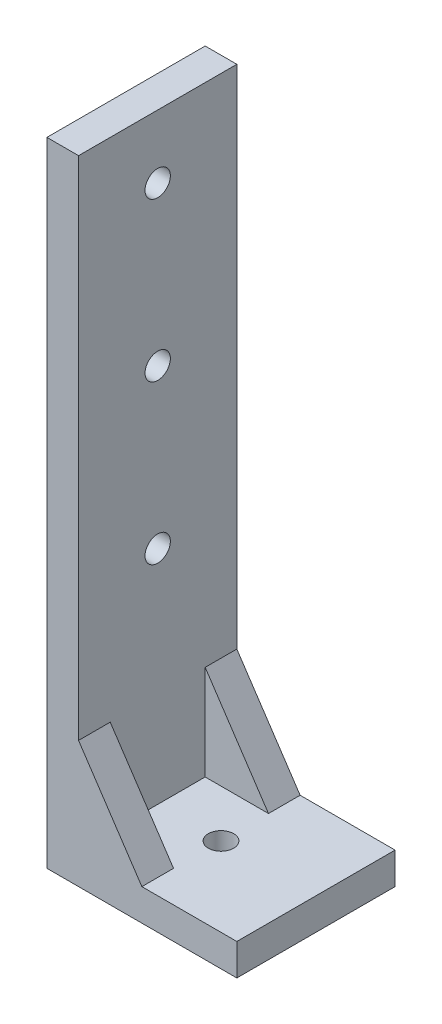
ISO-10303-21;
HEADER;
FILE_DESCRIPTION(('STEP AP214'),'2;1');
FILE_NAME('part.step','',(''),(''),'','','');
FILE_SCHEMA(('AUTOMOTIVE_DESIGN { 1 0 10303 214 1 1 1 1 }'));
ENDSEC;
DATA;
#1=APPLICATION_CONTEXT('core data for automotive mechanical design processes');
#2=APPLICATION_PROTOCOL_DEFINITION('international standard','automotive_design',2000,#1);
#3=PRODUCT_CONTEXT('',#1,'mechanical');
#4=PRODUCT('Part','Part','',(#3));
#5=PRODUCT_RELATED_PRODUCT_CATEGORY('part','',(#4));
#6=PRODUCT_DEFINITION_FORMATION('','',#4);
#7=PRODUCT_DEFINITION_CONTEXT('part definition',#1,'design');
#8=PRODUCT_DEFINITION('design','',#6,#7);
#9=PRODUCT_DEFINITION_SHAPE('','',#8);
#10=(LENGTH_UNIT() NAMED_UNIT(*) SI_UNIT(.MILLI.,.METRE.));
#11=(NAMED_UNIT(*) PLANE_ANGLE_UNIT() SI_UNIT($,.RADIAN.));
#12=(NAMED_UNIT(*) SI_UNIT($,.STERADIAN.) SOLID_ANGLE_UNIT());
#13=UNCERTAINTY_MEASURE_WITH_UNIT(LENGTH_MEASURE(1.E-05),#10,'distance_accuracy_value','');
#14=(GEOMETRIC_REPRESENTATION_CONTEXT(3) GLOBAL_UNCERTAINTY_ASSIGNED_CONTEXT((#13)) GLOBAL_UNIT_ASSIGNED_CONTEXT((#10,
#11,#12)) REPRESENTATION_CONTEXT('',''));
#15=CARTESIAN_POINT('',(0.,0.,0.));
#16=DIRECTION('',(0.,0.,1.));
#17=DIRECTION('',(1.,0.,0.));
#18=AXIS2_PLACEMENT_3D('',#15,#16,#17);
#19=CARTESIAN_POINT('',(60.,10.,25.));
#20=DIRECTION('',(0.,-1.,0.));
#21=DIRECTION('',(1.,0.,0.));
#22=AXIS2_PLACEMENT_3D('',#19,#20,#21);
#23=PLANE('',#22);
#24=CARTESIAN_POINT('',(30.,9.99999999999999,0.));
#25=DIRECTION('',(0.,1.,0.));
#26=DIRECTION('',(-1.,0.,0.));
#27=AXIS2_PLACEMENT_3D('',#24,#25,#26);
#28=CIRCLE('',#27,4.);
#29=CARTESIAN_POINT('',(26.,9.99999999999999,0.));
#30=VERTEX_POINT('',#29);
#31=EDGE_CURVE('E168',#30,#30,#28,.T.);
#32=ORIENTED_EDGE('',*,*,#31,.F.);
#33=EDGE_LOOP('',(#32));
#34=FACE_BOUND('',#33,.T.);
#35=DIRECTION('',(0.,0.,-1.));
#36=VECTOR('',#35,1.);
#37=CARTESIAN_POINT('',(30.,10.,-15.));
#38=LINE('',#37,#36);
#39=CARTESIAN_POINT('',(30.,10.,-15.));
#40=VERTEX_POINT('',#39);
#41=CARTESIAN_POINT('',(30.,9.99999999999999,-25.));
#42=VERTEX_POINT('',#41);
#43=EDGE_CURVE('E48',#40,#42,#38,.T.);
#44=ORIENTED_EDGE('',*,*,#43,.F.);
#45=DIRECTION('',(1.,0.,0.));
#46=VECTOR('',#45,1.);
#47=CARTESIAN_POINT('',(10.,9.99999999999999,-15.));
#48=LINE('',#47,#46);
#49=CARTESIAN_POINT('',(10.,9.99999999999999,-15.));
#50=VERTEX_POINT('',#49);
#51=EDGE_CURVE('E127',#50,#40,#48,.T.);
#52=ORIENTED_EDGE('',*,*,#51,.F.);
#53=DIRECTION('',(0.,0.,-1.));
#54=VECTOR('',#53,1.);
#55=CARTESIAN_POINT('',(10.,9.99999999999999,25.));
#56=LINE('',#55,#54);
#57=CARTESIAN_POINT('',(10.,9.99999999999999,15.));
#58=VERTEX_POINT('',#57);
#59=EDGE_CURVE('E122',#58,#50,#56,.T.);
#60=ORIENTED_EDGE('',*,*,#59,.F.);
#61=DIRECTION('',(1.,0.,0.));
#62=VECTOR('',#61,1.);
#63=CARTESIAN_POINT('',(10.,9.99999999999999,15.));
#64=LINE('',#63,#62);
#65=CARTESIAN_POINT('',(30.,10.,15.));
#66=VERTEX_POINT('',#65);
#67=EDGE_CURVE('E111',#58,#66,#64,.T.);
#68=ORIENTED_EDGE('',*,*,#67,.T.);
#69=DIRECTION('',(0.,0.,1.));
#70=VECTOR('',#69,1.);
#71=CARTESIAN_POINT('',(30.,10.,15.));
#72=LINE('',#71,#70);
#73=CARTESIAN_POINT('',(30.,10.,25.));
#74=VERTEX_POINT('',#73);
#75=EDGE_CURVE('E191',#66,#74,#72,.T.);
#76=ORIENTED_EDGE('',*,*,#75,.T.);
#77=DIRECTION('',(-1.,0.,0.));
#78=VECTOR('',#77,1.);
#79=CARTESIAN_POINT('',(60.,10.,25.));
#80=LINE('',#79,#78);
#81=CARTESIAN_POINT('',(60.,10.,25.));
#82=VERTEX_POINT('',#81);
#83=EDGE_CURVE('E161',#82,#74,#80,.T.);
#84=ORIENTED_EDGE('',*,*,#83,.F.);
#85=DIRECTION('',(0.,0.,-1.));
#86=VECTOR('',#85,1.);
#87=CARTESIAN_POINT('',(60.,10.,25.));
#88=LINE('',#87,#86);
#89=CARTESIAN_POINT('',(60.,10.,-25.));
#90=VERTEX_POINT('',#89);
#91=EDGE_CURVE('E41',#82,#90,#88,.T.);
#92=ORIENTED_EDGE('',*,*,#91,.T.);
#93=DIRECTION('',(-1.,0.,0.));
#94=VECTOR('',#93,1.);
#95=CARTESIAN_POINT('',(60.,10.,-25.));
#96=LINE('',#95,#94);
#97=EDGE_CURVE('E148',#90,#42,#96,.T.);
#98=ORIENTED_EDGE('',*,*,#97,.T.);
#99=EDGE_LOOP('',(#44,#52,#60,#68,#76,#84,#92,#98));
#100=FACE_BOUND('',#99,.T.);
#101=ADVANCED_FACE('F33',(#34,#100),#23,.F.);
#102=CARTESIAN_POINT('',(10.,9.99999999999999,25.));
#103=DIRECTION('',(-1.,0.,0.));
#104=DIRECTION('',(0.,0.,1.));
#105=AXIS2_PLACEMENT_3D('',#102,#103,#104);
#106=PLANE('',#105);
#107=CARTESIAN_POINT('',(10.,80.,0.));
#108=DIRECTION('',(1.,0.,0.));
#109=DIRECTION('',(0.,0.,-1.));
#110=AXIS2_PLACEMENT_3D('',#107,#108,#109);
#111=CIRCLE('',#110,4.);
#112=CARTESIAN_POINT('',(10.,80.,-4.));
#113=VERTEX_POINT('',#112);
#114=EDGE_CURVE('E174',#113,#113,#111,.T.);
#115=ORIENTED_EDGE('',*,*,#114,.F.);
#116=EDGE_LOOP('',(#115));
#117=FACE_BOUND('',#116,.T.);
#118=CARTESIAN_POINT('',(10.,130.,0.));
#119=DIRECTION('',(1.,0.,0.));
#120=DIRECTION('',(0.,0.,-1.));
#121=AXIS2_PLACEMENT_3D('',#118,#119,#120);
#122=CIRCLE('',#121,4.);
#123=CARTESIAN_POINT('',(10.,130.,-4.));
#124=VERTEX_POINT('',#123);
#125=EDGE_CURVE('E180',#124,#124,#122,.T.);
#126=ORIENTED_EDGE('',*,*,#125,.F.);
#127=EDGE_LOOP('',(#126));
#128=FACE_BOUND('',#127,.T.);
#129=CARTESIAN_POINT('',(10.,180.,0.));
#130=DIRECTION('',(1.,0.,0.));
#131=DIRECTION('',(0.,0.,-1.));
#132=AXIS2_PLACEMENT_3D('',#129,#130,#131);
#133=CIRCLE('',#132,4.);
#134=CARTESIAN_POINT('',(10.,180.,-4.));
#135=VERTEX_POINT('',#134);
#136=EDGE_CURVE('E186',#135,#135,#133,.T.);
#137=ORIENTED_EDGE('',*,*,#136,.F.);
#138=EDGE_LOOP('',(#137));
#139=FACE_BOUND('',#138,.T.);
#140=DIRECTION('',(0.,0.,-1.));
#141=VECTOR('',#140,1.);
#142=CARTESIAN_POINT('',(10.,40.,-15.));
#143=LINE('',#142,#141);
#144=CARTESIAN_POINT('',(10.,40.,-15.));
#145=VERTEX_POINT('',#144);
#146=CARTESIAN_POINT('',(10.,40.,-25.));
#147=VERTEX_POINT('',#146);
#148=EDGE_CURVE('E197',#145,#147,#143,.T.);
#149=ORIENTED_EDGE('',*,*,#148,.T.);
#150=DIRECTION('',(0.,1.,0.));
#151=VECTOR('',#150,1.);
#152=CARTESIAN_POINT('',(10.,9.99999999999999,-25.));
#153=LINE('',#152,#151);
#154=CARTESIAN_POINT('',(10.,200.,-25.));
#155=VERTEX_POINT('',#154);
#156=EDGE_CURVE('E146',#147,#155,#153,.T.);
#157=ORIENTED_EDGE('',*,*,#156,.T.);
#158=DIRECTION('',(0.,0.,-1.));
#159=VECTOR('',#158,1.);
#160=CARTESIAN_POINT('',(10.,200.,25.));
#161=LINE('',#160,#159);
#162=CARTESIAN_POINT('',(10.,200.,25.));
#163=VERTEX_POINT('',#162);
#164=EDGE_CURVE('E128',#163,#155,#161,.T.);
#165=ORIENTED_EDGE('',*,*,#164,.F.);
#166=DIRECTION('',(0.,1.,0.));
#167=VECTOR('',#166,1.);
#168=CARTESIAN_POINT('',(10.,9.99999999999999,25.));
#169=LINE('',#168,#167);
#170=CARTESIAN_POINT('',(10.,40.,25.));
#171=VERTEX_POINT('',#170);
#172=EDGE_CURVE('E159',#171,#163,#169,.T.);
#173=ORIENTED_EDGE('',*,*,#172,.F.);
#174=DIRECTION('',(0.,0.,1.));
#175=VECTOR('',#174,1.);
#176=CARTESIAN_POINT('',(10.,40.,15.));
#177=LINE('',#176,#175);
#178=CARTESIAN_POINT('',(10.,40.,15.));
#179=VERTEX_POINT('',#178);
#180=EDGE_CURVE('E124',#179,#171,#177,.T.);
#181=ORIENTED_EDGE('',*,*,#180,.F.);
#182=DIRECTION('',(0.,-1.,0.));
#183=VECTOR('',#182,1.);
#184=CARTESIAN_POINT('',(10.,40.,15.));
#185=LINE('',#184,#183);
#186=EDGE_CURVE('E114',#179,#58,#185,.T.);
#187=ORIENTED_EDGE('',*,*,#186,.T.);
#188=ORIENTED_EDGE('',*,*,#59,.T.);
#189=DIRECTION('',(0.,-1.,0.));
#190=VECTOR('',#189,1.);
#191=CARTESIAN_POINT('',(10.,40.,-15.));
#192=LINE('',#191,#190);
#193=EDGE_CURVE('E56',#145,#50,#192,.T.);
#194=ORIENTED_EDGE('',*,*,#193,.F.);
#195=EDGE_LOOP('',(#149,#157,#165,#173,#181,#187,#188,#194));
#196=FACE_BOUND('',#195,.T.);
#197=ADVANCED_FACE('F121',(#117,#128,#139,#196),#106,.F.);
#198=CARTESIAN_POINT('',(0.,0.,25.));
#199=DIRECTION('',(0.,1.,0.));
#200=DIRECTION('',(0.,0.,1.));
#201=AXIS2_PLACEMENT_3D('',#198,#199,#200);
#202=PLANE('',#201);
#203=CARTESIAN_POINT('',(30.,0.,0.));
#204=DIRECTION('',(0.,1.,0.));
#205=DIRECTION('',(-1.,0.,0.));
#206=AXIS2_PLACEMENT_3D('',#203,#204,#205);
#207=CIRCLE('',#206,4.);
#208=CARTESIAN_POINT('',(26.,0.,0.));
#209=VERTEX_POINT('',#208);
#210=EDGE_CURVE('E155',#209,#209,#207,.T.);
#211=ORIENTED_EDGE('',*,*,#210,.T.);
#212=EDGE_LOOP('',(#211));
#213=FACE_BOUND('',#212,.T.);
#214=DIRECTION('',(1.,0.,0.));
#215=VECTOR('',#214,1.);
#216=CARTESIAN_POINT('',(0.,0.,-25.));
#217=LINE('',#216,#215);
#218=CARTESIAN_POINT('',(0.,0.,-25.));
#219=VERTEX_POINT('',#218);
#220=CARTESIAN_POINT('',(60.,0.,-25.));
#221=VERTEX_POINT('',#220);
#222=EDGE_CURVE('E152',#219,#221,#217,.T.);
#223=ORIENTED_EDGE('',*,*,#222,.T.);
#224=DIRECTION('',(0.,0.,-1.));
#225=VECTOR('',#224,1.);
#226=CARTESIAN_POINT('',(60.,0.,25.));
#227=LINE('',#226,#225);
#228=CARTESIAN_POINT('',(60.,0.,25.));
#229=VERTEX_POINT('',#228);
#230=EDGE_CURVE('E11',#229,#221,#227,.T.);
#231=ORIENTED_EDGE('',*,*,#230,.F.);
#232=DIRECTION('',(1.,0.,0.));
#233=VECTOR('',#232,1.);
#234=CARTESIAN_POINT('',(0.,0.,25.));
#235=LINE('',#234,#233);
#236=CARTESIAN_POINT('',(0.,0.,25.));
#237=VERTEX_POINT('',#236);
#238=EDGE_CURVE('E143',#237,#229,#235,.T.);
#239=ORIENTED_EDGE('',*,*,#238,.F.);
#240=DIRECTION('',(0.,0.,-1.));
#241=VECTOR('',#240,1.);
#242=CARTESIAN_POINT('',(0.,0.,25.));
#243=LINE('',#242,#241);
#244=EDGE_CURVE('E137',#237,#219,#243,.T.);
#245=ORIENTED_EDGE('',*,*,#244,.T.);
#246=EDGE_LOOP('',(#223,#231,#239,#245));
#247=FACE_BOUND('',#246,.T.);
#248=ADVANCED_FACE('F35',(#213,#247),#202,.F.);
#249=CARTESIAN_POINT('',(60.,0.,25.));
#250=DIRECTION('',(-1.,0.,0.));
#251=DIRECTION('',(0.,0.,1.));
#252=AXIS2_PLACEMENT_3D('',#249,#250,#251);
#253=PLANE('',#252);
#254=DIRECTION('',(0.,1.,0.));
#255=VECTOR('',#254,1.);
#256=CARTESIAN_POINT('',(60.,0.,-25.));
#257=LINE('',#256,#255);
#258=EDGE_CURVE('E150',#221,#90,#257,.T.);
#259=ORIENTED_EDGE('',*,*,#258,.T.);
#260=ORIENTED_EDGE('',*,*,#91,.F.);
#261=DIRECTION('',(0.,1.,0.));
#262=VECTOR('',#261,1.);
#263=CARTESIAN_POINT('',(60.,0.,25.));
#264=LINE('',#263,#262);
#265=EDGE_CURVE('E164',#229,#82,#264,.T.);
#266=ORIENTED_EDGE('',*,*,#265,.F.);
#267=ORIENTED_EDGE('',*,*,#230,.T.);
#268=EDGE_LOOP('',(#259,#260,#266,#267));
#269=FACE_BOUND('',#268,.T.);
#270=ADVANCED_FACE('F238',(#269),#253,.F.);
#271=CARTESIAN_POINT('',(10.,200.,25.));
#272=DIRECTION('',(0.,-1.,0.));
#273=DIRECTION('',(0.,0.,-1.));
#274=AXIS2_PLACEMENT_3D('',#271,#272,#273);
#275=PLANE('',#274);
#276=DIRECTION('',(-1.,0.,0.));
#277=VECTOR('',#276,1.);
#278=CARTESIAN_POINT('',(10.,200.,-25.));
#279=LINE('',#278,#277);
#280=CARTESIAN_POINT('',(0.,200.,-25.));
#281=VERTEX_POINT('',#280);
#282=EDGE_CURVE('E144',#155,#281,#279,.T.);
#283=ORIENTED_EDGE('',*,*,#282,.T.);
#284=DIRECTION('',(0.,0.,-1.));
#285=VECTOR('',#284,1.);
#286=CARTESIAN_POINT('',(0.,200.,25.));
#287=LINE('',#286,#285);
#288=CARTESIAN_POINT('',(0.,200.,25.));
#289=VERTEX_POINT('',#288);
#290=EDGE_CURVE('E132',#289,#281,#287,.T.);
#291=ORIENTED_EDGE('',*,*,#290,.F.);
#292=DIRECTION('',(-1.,0.,0.));
#293=VECTOR('',#292,1.);
#294=CARTESIAN_POINT('',(10.,200.,25.));
#295=LINE('',#294,#293);
#296=EDGE_CURVE('E157',#163,#289,#295,.T.);
#297=ORIENTED_EDGE('',*,*,#296,.F.);
#298=ORIENTED_EDGE('',*,*,#164,.T.);
#299=EDGE_LOOP('',(#283,#291,#297,#298));
#300=FACE_BOUND('',#299,.T.);
#301=ADVANCED_FACE('F223',(#300),#275,.F.);
#302=CARTESIAN_POINT('',(0.,0.,25.));
#303=DIRECTION('',(1.,0.,0.));
#304=DIRECTION('',(0.,0.,-1.));
#305=AXIS2_PLACEMENT_3D('',#302,#303,#304);
#306=PLANE('',#305);
#307=CARTESIAN_POINT('',(0.,180.,0.));
#308=DIRECTION('',(1.,0.,0.));
#309=DIRECTION('',(0.,0.,-1.));
#310=AXIS2_PLACEMENT_3D('',#307,#308,#309);
#311=CIRCLE('',#310,4.);
#312=CARTESIAN_POINT('',(0.,180.,-4.));
#313=VERTEX_POINT('',#312);
#314=EDGE_CURVE('E171',#313,#313,#311,.T.);
#315=ORIENTED_EDGE('',*,*,#314,.T.);
#316=EDGE_LOOP('',(#315));
#317=FACE_BOUND('',#316,.T.);
#318=CARTESIAN_POINT('',(0.,130.,0.));
#319=DIRECTION('',(1.,0.,0.));
#320=DIRECTION('',(0.,0.,-1.));
#321=AXIS2_PLACEMENT_3D('',#318,#319,#320);
#322=CIRCLE('',#321,4.);
#323=CARTESIAN_POINT('',(0.,130.,-4.));
#324=VERTEX_POINT('',#323);
#325=EDGE_CURVE('E183',#324,#324,#322,.T.);
#326=ORIENTED_EDGE('',*,*,#325,.T.);
#327=EDGE_LOOP('',(#326));
#328=FACE_BOUND('',#327,.T.);
#329=CARTESIAN_POINT('',(0.,80.,0.));
#330=DIRECTION('',(1.,0.,0.));
#331=DIRECTION('',(0.,0.,-1.));
#332=AXIS2_PLACEMENT_3D('',#329,#330,#331);
#333=CIRCLE('',#332,4.);
#334=CARTESIAN_POINT('',(0.,80.,-4.));
#335=VERTEX_POINT('',#334);
#336=EDGE_CURVE('E177',#335,#335,#333,.T.);
#337=ORIENTED_EDGE('',*,*,#336,.T.);
#338=EDGE_LOOP('',(#337));
#339=FACE_BOUND('',#338,.T.);
#340=DIRECTION('',(0.,-1.,0.));
#341=VECTOR('',#340,1.);
#342=CARTESIAN_POINT('',(0.,0.,-25.));
#343=LINE('',#342,#341);
#344=EDGE_CURVE('E141',#281,#219,#343,.T.);
#345=ORIENTED_EDGE('',*,*,#344,.T.);
#346=ORIENTED_EDGE('',*,*,#244,.F.);
#347=DIRECTION('',(0.,-1.,0.));
#348=VECTOR('',#347,1.);
#349=CARTESIAN_POINT('',(0.,0.,25.));
#350=LINE('',#349,#348);
#351=EDGE_CURVE('E140',#289,#237,#350,.T.);
#352=ORIENTED_EDGE('',*,*,#351,.F.);
#353=ORIENTED_EDGE('',*,*,#290,.T.);
#354=EDGE_LOOP('',(#345,#346,#352,#353));
#355=FACE_BOUND('',#354,.T.);
#356=ADVANCED_FACE('F227',(#317,#328,#339,#355),#306,.F.);
#357=CARTESIAN_POINT('',(0.,0.,25.));
#358=DIRECTION('',(0.,0.,1.));
#359=DIRECTION('',(1.,0.,0.));
#360=AXIS2_PLACEMENT_3D('',#357,#358,#359);
#361=PLANE('',#360);
#362=DIRECTION('',(-0.554700196225229,0.832050294337844,0.));
#363=VECTOR('',#362,1.);
#364=CARTESIAN_POINT('',(30.,10.,25.));
#365=LINE('',#364,#363);
#366=EDGE_CURVE('E125',#74,#171,#365,.T.);
#367=ORIENTED_EDGE('',*,*,#366,.T.);
#368=ORIENTED_EDGE('',*,*,#172,.T.);
#369=ORIENTED_EDGE('',*,*,#296,.T.);
#370=ORIENTED_EDGE('',*,*,#351,.T.);
#371=ORIENTED_EDGE('',*,*,#238,.T.);
#372=ORIENTED_EDGE('',*,*,#265,.T.);
#373=ORIENTED_EDGE('',*,*,#83,.T.);
#374=EDGE_LOOP('',(#367,#368,#369,#370,#371,#372,#373));
#375=FACE_BOUND('',#374,.T.);
#376=ADVANCED_FACE('F231',(#375),#361,.T.);
#377=CARTESIAN_POINT('',(0.,0.,-25.));
#378=DIRECTION('',(0.,0.,1.));
#379=DIRECTION('',(1.,0.,0.));
#380=AXIS2_PLACEMENT_3D('',#377,#378,#379);
#381=PLANE('',#380);
#382=ORIENTED_EDGE('',*,*,#156,.F.);
#383=DIRECTION('',(-0.554700196225229,0.832050294337844,0.));
#384=VECTOR('',#383,1.);
#385=CARTESIAN_POINT('',(30.,10.,-25.));
#386=LINE('',#385,#384);
#387=EDGE_CURVE('E200',#42,#147,#386,.T.);
#388=ORIENTED_EDGE('',*,*,#387,.F.);
#389=ORIENTED_EDGE('',*,*,#97,.F.);
#390=ORIENTED_EDGE('',*,*,#258,.F.);
#391=ORIENTED_EDGE('',*,*,#222,.F.);
#392=ORIENTED_EDGE('',*,*,#344,.F.);
#393=ORIENTED_EDGE('',*,*,#282,.F.);
#394=EDGE_LOOP('',(#382,#388,#389,#390,#391,#392,#393));
#395=FACE_BOUND('',#394,.T.);
#396=ADVANCED_FACE('F217',(#395),#381,.F.);
#397=CARTESIAN_POINT('',(30.,0.,0.));
#398=DIRECTION('',(0.,1.,0.));
#399=DIRECTION('',(-1.,0.,0.));
#400=AXIS2_PLACEMENT_3D('',#397,#398,#399);
#401=CYLINDRICAL_SURFACE('',#400,4.);
#402=ORIENTED_EDGE('',*,*,#210,.F.);
#403=EDGE_LOOP('',(#402));
#404=FACE_BOUND('',#403,.T.);
#405=ORIENTED_EDGE('',*,*,#31,.T.);
#406=EDGE_LOOP('',(#405));
#407=FACE_BOUND('',#406,.T.);
#408=ADVANCED_FACE('F265',(#404,#407),#401,.F.);
#409=CARTESIAN_POINT('',(0.,80.,0.));
#410=DIRECTION('',(1.,0.,0.));
#411=DIRECTION('',(0.,0.,-1.));
#412=AXIS2_PLACEMENT_3D('',#409,#410,#411);
#413=CYLINDRICAL_SURFACE('',#412,4.);
#414=ORIENTED_EDGE('',*,*,#336,.F.);
#415=EDGE_LOOP('',(#414));
#416=FACE_BOUND('',#415,.T.);
#417=ORIENTED_EDGE('',*,*,#114,.T.);
#418=EDGE_LOOP('',(#417));
#419=FACE_BOUND('',#418,.T.);
#420=ADVANCED_FACE('F270',(#416,#419),#413,.F.);
#421=CARTESIAN_POINT('',(0.,130.,0.));
#422=DIRECTION('',(1.,0.,0.));
#423=DIRECTION('',(0.,0.,-1.));
#424=AXIS2_PLACEMENT_3D('',#421,#422,#423);
#425=CYLINDRICAL_SURFACE('',#424,4.);
#426=ORIENTED_EDGE('',*,*,#325,.F.);
#427=EDGE_LOOP('',(#426));
#428=FACE_BOUND('',#427,.T.);
#429=ORIENTED_EDGE('',*,*,#125,.T.);
#430=EDGE_LOOP('',(#429));
#431=FACE_BOUND('',#430,.T.);
#432=ADVANCED_FACE('F274',(#428,#431),#425,.F.);
#433=CARTESIAN_POINT('',(0.,180.,0.));
#434=DIRECTION('',(1.,0.,0.));
#435=DIRECTION('',(0.,0.,-1.));
#436=AXIS2_PLACEMENT_3D('',#433,#434,#435);
#437=CYLINDRICAL_SURFACE('',#436,4.);
#438=ORIENTED_EDGE('',*,*,#314,.F.);
#439=EDGE_LOOP('',(#438));
#440=FACE_BOUND('',#439,.T.);
#441=ORIENTED_EDGE('',*,*,#136,.T.);
#442=EDGE_LOOP('',(#441));
#443=FACE_BOUND('',#442,.T.);
#444=ADVANCED_FACE('F278',(#440,#443),#437,.F.);
#445=CARTESIAN_POINT('',(30.,10.,15.));
#446=DIRECTION('',(0.832050294337844,0.554700196225229,0.));
#447=DIRECTION('',(-0.554700196225229,0.832050294337844,0.));
#448=AXIS2_PLACEMENT_3D('',#445,#446,#447);
#449=PLANE('',#448);
#450=ORIENTED_EDGE('',*,*,#366,.F.);
#451=ORIENTED_EDGE('',*,*,#75,.F.);
#452=DIRECTION('',(-0.554700196225229,0.832050294337844,0.));
#453=VECTOR('',#452,1.);
#454=CARTESIAN_POINT('',(30.,10.,15.));
#455=LINE('',#454,#453);
#456=EDGE_CURVE('E116',#66,#179,#455,.T.);
#457=ORIENTED_EDGE('',*,*,#456,.T.);
#458=ORIENTED_EDGE('',*,*,#180,.T.);
#459=EDGE_LOOP('',(#450,#451,#457,#458));
#460=FACE_BOUND('',#459,.T.);
#461=ADVANCED_FACE('F235',(#460),#449,.T.);
#462=CARTESIAN_POINT('',(0.,0.,15.));
#463=DIRECTION('',(0.,0.,1.));
#464=DIRECTION('',(1.,0.,0.));
#465=AXIS2_PLACEMENT_3D('',#462,#463,#464);
#466=PLANE('',#465);
#467=ORIENTED_EDGE('',*,*,#186,.F.);
#468=ORIENTED_EDGE('',*,*,#456,.F.);
#469=ORIENTED_EDGE('',*,*,#67,.F.);
#470=EDGE_LOOP('',(#467,#468,#469));
#471=FACE_BOUND('',#470,.T.);
#472=ADVANCED_FACE('F113',(#471),#466,.F.);
#473=CARTESIAN_POINT('',(30.,10.,-15.));
#474=DIRECTION('',(-0.832050294337844,-0.554700196225229,0.));
#475=DIRECTION('',(0.554700196225229,-0.832050294337844,0.));
#476=AXIS2_PLACEMENT_3D('',#473,#474,#475);
#477=PLANE('',#476);
#478=ORIENTED_EDGE('',*,*,#387,.T.);
#479=ORIENTED_EDGE('',*,*,#148,.F.);
#480=DIRECTION('',(-0.554700196225229,0.832050294337844,0.));
#481=VECTOR('',#480,1.);
#482=CARTESIAN_POINT('',(30.,10.,-15.));
#483=LINE('',#482,#481);
#484=EDGE_CURVE('E204',#40,#145,#483,.T.);
#485=ORIENTED_EDGE('',*,*,#484,.F.);
#486=ORIENTED_EDGE('',*,*,#43,.T.);
#487=EDGE_LOOP('',(#478,#479,#485,#486));
#488=FACE_BOUND('',#487,.T.);
#489=ADVANCED_FACE('F211',(#488),#477,.F.);
#490=CARTESIAN_POINT('',(0.,0.,-15.));
#491=DIRECTION('',(0.,0.,-1.));
#492=DIRECTION('',(1.,0.,0.));
#493=AXIS2_PLACEMENT_3D('',#490,#491,#492);
#494=PLANE('',#493);
#495=ORIENTED_EDGE('',*,*,#193,.T.);
#496=ORIENTED_EDGE('',*,*,#51,.T.);
#497=ORIENTED_EDGE('',*,*,#484,.T.);
#498=EDGE_LOOP('',(#495,#496,#497));
#499=FACE_BOUND('',#498,.T.);
#500=ADVANCED_FACE('F207',(#499),#494,.F.);
#501=CLOSED_SHELL('',(#101,#197,#248,#270,#301,#356,#376,#396,#408,#420,#432,#444,#461,#472,
#489,#500));
#502=MANIFOLD_SOLID_BREP('B2',#501);
#503=ADVANCED_BREP_SHAPE_REPRESENTATION('',(#18,#502),#14);
#504=SHAPE_DEFINITION_REPRESENTATION(#9,#503);
ENDSEC;
END-ISO-10303-21;
